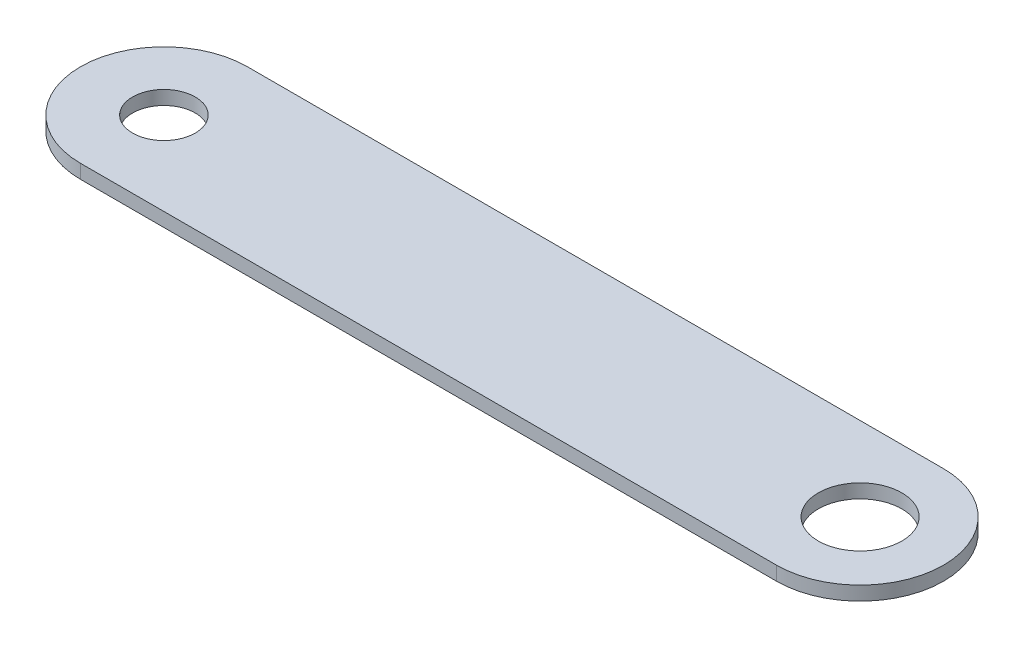
ISO-10303-21;
HEADER;
FILE_DESCRIPTION(('STEP AP214'),'2;1');
FILE_NAME('part.step','',(''),(''),'','','');
FILE_SCHEMA(('AUTOMOTIVE_DESIGN { 1 0 10303 214 1 1 1 1 }'));
ENDSEC;
DATA;
#1=APPLICATION_CONTEXT('core data for automotive mechanical design processes');
#2=APPLICATION_PROTOCOL_DEFINITION('international standard','automotive_design',2000,#1);
#3=PRODUCT_CONTEXT('',#1,'mechanical');
#4=PRODUCT('Part','Part','',(#3));
#5=PRODUCT_RELATED_PRODUCT_CATEGORY('part','',(#4));
#6=PRODUCT_DEFINITION_FORMATION('','',#4);
#7=PRODUCT_DEFINITION_CONTEXT('part definition',#1,'design');
#8=PRODUCT_DEFINITION('design','',#6,#7);
#9=PRODUCT_DEFINITION_SHAPE('','',#8);
#10=(LENGTH_UNIT() NAMED_UNIT(*) SI_UNIT(.MILLI.,.METRE.));
#11=(NAMED_UNIT(*) PLANE_ANGLE_UNIT() SI_UNIT($,.RADIAN.));
#12=(NAMED_UNIT(*) SI_UNIT($,.STERADIAN.) SOLID_ANGLE_UNIT());
#13=UNCERTAINTY_MEASURE_WITH_UNIT(LENGTH_MEASURE(1.E-05),#10,'distance_accuracy_value','');
#14=(GEOMETRIC_REPRESENTATION_CONTEXT(3) GLOBAL_UNCERTAINTY_ASSIGNED_CONTEXT((#13)) GLOBAL_UNIT_ASSIGNED_CONTEXT((#10,
#11,#12)) REPRESENTATION_CONTEXT('',''));
#15=CARTESIAN_POINT('',(0.,0.,0.));
#16=DIRECTION('',(0.,0.,1.));
#17=DIRECTION('',(1.,0.,0.));
#18=AXIS2_PLACEMENT_3D('',#15,#16,#17);
#19=CARTESIAN_POINT('',(0.,1.,0.));
#20=DIRECTION('',(0.,1.,0.));
#21=DIRECTION('',(0.,0.,1.));
#22=AXIS2_PLACEMENT_3D('',#19,#20,#21);
#23=PLANE('',#22);
#24=CARTESIAN_POINT('',(0.,1.,0.));
#25=DIRECTION('',(0.,1.,0.));
#26=DIRECTION('',(0.,0.,1.));
#27=AXIS2_PLACEMENT_3D('',#24,#25,#26);
#28=CIRCLE('',#27,2.25);
#29=CARTESIAN_POINT('',(0.,1.,2.25));
#30=VERTEX_POINT('',#29);
#31=EDGE_CURVE('E101',#30,#30,#28,.T.);
#32=ORIENTED_EDGE('',*,*,#31,.F.);
#33=EDGE_LOOP('',(#32));
#34=FACE_BOUND('',#33,.T.);
#35=CARTESIAN_POINT('',(0.,1.,0.));
#36=DIRECTION('',(0.,1.,0.));
#37=DIRECTION('',(0.,0.,1.));
#38=AXIS2_PLACEMENT_3D('',#35,#36,#37);
#39=CIRCLE('',#38,6.);
#40=CARTESIAN_POINT('',(0.,1.,-6.));
#41=VERTEX_POINT('',#40);
#42=CARTESIAN_POINT('',(0.,1.,6.));
#43=VERTEX_POINT('',#42);
#44=EDGE_CURVE('E86',#41,#43,#39,.T.);
#45=ORIENTED_EDGE('',*,*,#44,.T.);
#46=DIRECTION('',(1.,0.,0.));
#47=VECTOR('',#46,1.);
#48=CARTESIAN_POINT('',(0.,1.,6.));
#49=LINE('',#48,#47);
#50=CARTESIAN_POINT('',(50.,1.,6.));
#51=VERTEX_POINT('',#50);
#52=EDGE_CURVE('E81',#43,#51,#49,.T.);
#53=ORIENTED_EDGE('',*,*,#52,.T.);
#54=CARTESIAN_POINT('',(50.,1.,0.));
#55=DIRECTION('',(0.,1.,0.));
#56=DIRECTION('',(0.,0.,1.));
#57=AXIS2_PLACEMENT_3D('',#54,#55,#56);
#58=CIRCLE('',#57,6.);
#59=CARTESIAN_POINT('',(50.,1.,-6.));
#60=VERTEX_POINT('',#59);
#61=EDGE_CURVE('E84',#51,#60,#58,.T.);
#62=ORIENTED_EDGE('',*,*,#61,.T.);
#63=DIRECTION('',(-1.,0.,0.));
#64=VECTOR('',#63,1.);
#65=CARTESIAN_POINT('',(0.,1.,-6.));
#66=LINE('',#65,#64);
#67=EDGE_CURVE('E51',#60,#41,#66,.T.);
#68=ORIENTED_EDGE('',*,*,#67,.T.);
#69=EDGE_LOOP('',(#45,#53,#62,#68));
#70=FACE_BOUND('',#69,.T.);
#71=CARTESIAN_POINT('',(50.,1.,0.));
#72=DIRECTION('',(0.,1.,0.));
#73=DIRECTION('',(0.,0.,1.));
#74=AXIS2_PLACEMENT_3D('',#71,#72,#73);
#75=CIRCLE('',#74,3.);
#76=CARTESIAN_POINT('',(50.,1.,3.));
#77=VERTEX_POINT('',#76);
#78=EDGE_CURVE('E116',#77,#77,#75,.T.);
#79=ORIENTED_EDGE('',*,*,#78,.F.);
#80=EDGE_LOOP('',(#79));
#81=FACE_BOUND('',#80,.T.);
#82=ADVANCED_FACE('F34',(#34,#70,#81),#23,.T.);
#83=CARTESIAN_POINT('',(0.,0.,0.));
#84=DIRECTION('',(0.,1.,0.));
#85=DIRECTION('',(0.,0.,1.));
#86=AXIS2_PLACEMENT_3D('',#83,#84,#85);
#87=PLANE('',#86);
#88=CARTESIAN_POINT('',(0.,0.,0.));
#89=DIRECTION('',(0.,1.,0.));
#90=DIRECTION('',(0.,0.,1.));
#91=AXIS2_PLACEMENT_3D('',#88,#89,#90);
#92=CIRCLE('',#91,6.);
#93=CARTESIAN_POINT('',(0.,0.,-6.));
#94=VERTEX_POINT('',#93);
#95=CARTESIAN_POINT('',(0.,0.,6.));
#96=VERTEX_POINT('',#95);
#97=EDGE_CURVE('E98',#94,#96,#92,.T.);
#98=ORIENTED_EDGE('',*,*,#97,.F.);
#99=DIRECTION('',(-1.,0.,0.));
#100=VECTOR('',#99,1.);
#101=CARTESIAN_POINT('',(0.,0.,-6.));
#102=LINE('',#101,#100);
#103=CARTESIAN_POINT('',(50.,0.,-6.));
#104=VERTEX_POINT('',#103);
#105=EDGE_CURVE('E74',#104,#94,#102,.T.);
#106=ORIENTED_EDGE('',*,*,#105,.F.);
#107=CARTESIAN_POINT('',(50.,0.,0.));
#108=DIRECTION('',(0.,1.,0.));
#109=DIRECTION('',(0.,0.,1.));
#110=AXIS2_PLACEMENT_3D('',#107,#108,#109);
#111=CIRCLE('',#110,6.);
#112=CARTESIAN_POINT('',(50.,0.,6.));
#113=VERTEX_POINT('',#112);
#114=EDGE_CURVE('E68',#113,#104,#111,.T.);
#115=ORIENTED_EDGE('',*,*,#114,.F.);
#116=DIRECTION('',(1.,0.,0.));
#117=VECTOR('',#116,1.);
#118=CARTESIAN_POINT('',(0.,0.,6.));
#119=LINE('',#118,#117);
#120=EDGE_CURVE('E90',#96,#113,#119,.T.);
#121=ORIENTED_EDGE('',*,*,#120,.F.);
#122=EDGE_LOOP('',(#98,#106,#115,#121));
#123=FACE_BOUND('',#122,.T.);
#124=CARTESIAN_POINT('',(0.,0.,0.));
#125=DIRECTION('',(0.,1.,0.));
#126=DIRECTION('',(0.,0.,1.));
#127=AXIS2_PLACEMENT_3D('',#124,#125,#126);
#128=CIRCLE('',#127,2.25);
#129=CARTESIAN_POINT('',(0.,0.,2.25));
#130=VERTEX_POINT('',#129);
#131=EDGE_CURVE('E113',#130,#130,#128,.T.);
#132=ORIENTED_EDGE('',*,*,#131,.T.);
#133=EDGE_LOOP('',(#132));
#134=FACE_BOUND('',#133,.T.);
#135=CARTESIAN_POINT('',(50.,0.,0.));
#136=DIRECTION('',(0.,1.,0.));
#137=DIRECTION('',(0.,0.,1.));
#138=AXIS2_PLACEMENT_3D('',#135,#136,#137);
#139=CIRCLE('',#138,3.);
#140=CARTESIAN_POINT('',(50.,0.,3.));
#141=VERTEX_POINT('',#140);
#142=EDGE_CURVE('E119',#141,#141,#139,.T.);
#143=ORIENTED_EDGE('',*,*,#142,.T.);
#144=EDGE_LOOP('',(#143));
#145=FACE_BOUND('',#144,.T.);
#146=ADVANCED_FACE('F109',(#123,#134,#145),#87,.F.);
#147=CARTESIAN_POINT('',(0.,1.,0.));
#148=DIRECTION('',(0.,-1.,0.));
#149=DIRECTION('',(0.,0.,-1.));
#150=AXIS2_PLACEMENT_3D('',#147,#148,#149);
#151=CYLINDRICAL_SURFACE('',#150,6.);
#152=ORIENTED_EDGE('',*,*,#97,.T.);
#153=DIRECTION('',(0.,-1.,0.));
#154=VECTOR('',#153,1.);
#155=CARTESIAN_POINT('',(0.,1.,6.));
#156=LINE('',#155,#154);
#157=EDGE_CURVE('E11',#43,#96,#156,.T.);
#158=ORIENTED_EDGE('',*,*,#157,.F.);
#159=ORIENTED_EDGE('',*,*,#44,.F.);
#160=DIRECTION('',(0.,-1.,0.));
#161=VECTOR('',#160,1.);
#162=CARTESIAN_POINT('',(0.,1.,-6.));
#163=LINE('',#162,#161);
#164=EDGE_CURVE('E94',#41,#94,#163,.T.);
#165=ORIENTED_EDGE('',*,*,#164,.T.);
#166=EDGE_LOOP('',(#152,#158,#159,#165));
#167=FACE_BOUND('',#166,.T.);
#168=ADVANCED_FACE('F36',(#167),#151,.T.);
#169=CARTESIAN_POINT('',(0.,1.,6.));
#170=DIRECTION('',(0.,0.,-1.));
#171=DIRECTION('',(-1.,0.,0.));
#172=AXIS2_PLACEMENT_3D('',#169,#170,#171);
#173=PLANE('',#172);
#174=ORIENTED_EDGE('',*,*,#120,.T.);
#175=DIRECTION('',(0.,-1.,0.));
#176=VECTOR('',#175,1.);
#177=CARTESIAN_POINT('',(50.,1.,6.));
#178=LINE('',#177,#176);
#179=EDGE_CURVE('E43',#51,#113,#178,.T.);
#180=ORIENTED_EDGE('',*,*,#179,.F.);
#181=ORIENTED_EDGE('',*,*,#52,.F.);
#182=ORIENTED_EDGE('',*,*,#157,.T.);
#183=EDGE_LOOP('',(#174,#180,#181,#182));
#184=FACE_BOUND('',#183,.T.);
#185=ADVANCED_FACE('F89',(#184),#173,.F.);
#186=CARTESIAN_POINT('',(50.,1.,0.));
#187=DIRECTION('',(0.,-1.,0.));
#188=DIRECTION('',(0.,0.,-1.));
#189=AXIS2_PLACEMENT_3D('',#186,#187,#188);
#190=CYLINDRICAL_SURFACE('',#189,6.);
#191=ORIENTED_EDGE('',*,*,#114,.T.);
#192=DIRECTION('',(0.,-1.,0.));
#193=VECTOR('',#192,1.);
#194=CARTESIAN_POINT('',(50.,1.,-6.));
#195=LINE('',#194,#193);
#196=EDGE_CURVE('E91',#60,#104,#195,.T.);
#197=ORIENTED_EDGE('',*,*,#196,.F.);
#198=ORIENTED_EDGE('',*,*,#61,.F.);
#199=ORIENTED_EDGE('',*,*,#179,.T.);
#200=EDGE_LOOP('',(#191,#197,#198,#199));
#201=FACE_BOUND('',#200,.T.);
#202=ADVANCED_FACE('F92',(#201),#190,.T.);
#203=CARTESIAN_POINT('',(0.,1.,-6.));
#204=DIRECTION('',(0.,0.,1.));
#205=DIRECTION('',(1.,0.,0.));
#206=AXIS2_PLACEMENT_3D('',#203,#204,#205);
#207=PLANE('',#206);
#208=ORIENTED_EDGE('',*,*,#105,.T.);
#209=ORIENTED_EDGE('',*,*,#164,.F.);
#210=ORIENTED_EDGE('',*,*,#67,.F.);
#211=ORIENTED_EDGE('',*,*,#196,.T.);
#212=EDGE_LOOP('',(#208,#209,#210,#211));
#213=FACE_BOUND('',#212,.T.);
#214=ADVANCED_FACE('F106',(#213),#207,.F.);
#215=CARTESIAN_POINT('',(0.,1.,0.));
#216=DIRECTION('',(0.,-1.,0.));
#217=DIRECTION('',(0.,0.,-1.));
#218=AXIS2_PLACEMENT_3D('',#215,#216,#217);
#219=CYLINDRICAL_SURFACE('',#218,2.25);
#220=ORIENTED_EDGE('',*,*,#31,.T.);
#221=EDGE_LOOP('',(#220));
#222=FACE_BOUND('',#221,.T.);
#223=ORIENTED_EDGE('',*,*,#131,.F.);
#224=EDGE_LOOP('',(#223));
#225=FACE_BOUND('',#224,.T.);
#226=ADVANCED_FACE('F136',(#222,#225),#219,.F.);
#227=CARTESIAN_POINT('',(50.,1.,0.));
#228=DIRECTION('',(0.,-1.,0.));
#229=DIRECTION('',(0.,0.,-1.));
#230=AXIS2_PLACEMENT_3D('',#227,#228,#229);
#231=CYLINDRICAL_SURFACE('',#230,3.);
#232=ORIENTED_EDGE('',*,*,#78,.T.);
#233=EDGE_LOOP('',(#232));
#234=FACE_BOUND('',#233,.T.);
#235=ORIENTED_EDGE('',*,*,#142,.F.);
#236=EDGE_LOOP('',(#235));
#237=FACE_BOUND('',#236,.T.);
#238=ADVANCED_FACE('F125',(#234,#237),#231,.F.);
#239=CLOSED_SHELL('',(#82,#146,#168,#185,#202,#214,#226,#238));
#240=MANIFOLD_SOLID_BREP('B2',#239);
#241=ADVANCED_BREP_SHAPE_REPRESENTATION('',(#18,#240),#14);
#242=SHAPE_DEFINITION_REPRESENTATION(#9,#241);
ENDSEC;
END-ISO-10303-21;
